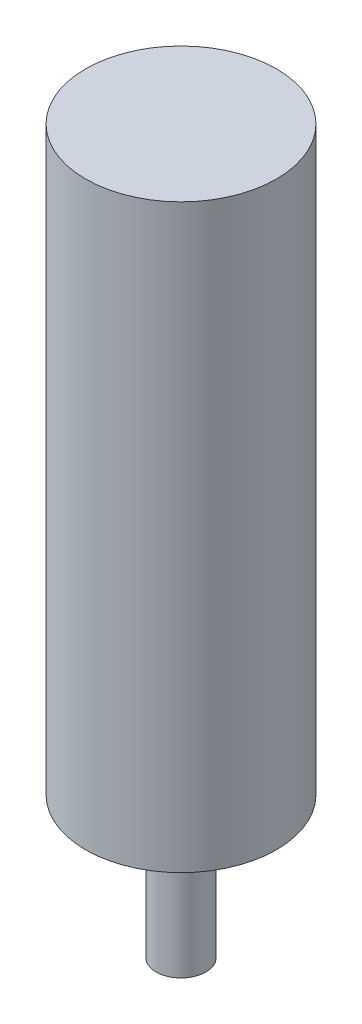
ISO-10303-21;
HEADER;
FILE_DESCRIPTION(('STEP AP214'),'2;1');
FILE_NAME('part.step','',(''),(''),'','','');
FILE_SCHEMA(('AUTOMOTIVE_DESIGN { 1 0 10303 214 1 1 1 1 }'));
ENDSEC;
DATA;
#1=APPLICATION_CONTEXT('core data for automotive mechanical design processes');
#2=APPLICATION_PROTOCOL_DEFINITION('international standard','automotive_design',2000,#1);
#3=PRODUCT_CONTEXT('',#1,'mechanical');
#4=PRODUCT('Part','Part','',(#3));
#5=PRODUCT_RELATED_PRODUCT_CATEGORY('part','',(#4));
#6=PRODUCT_DEFINITION_FORMATION('','',#4);
#7=PRODUCT_DEFINITION_CONTEXT('part definition',#1,'design');
#8=PRODUCT_DEFINITION('design','',#6,#7);
#9=PRODUCT_DEFINITION_SHAPE('','',#8);
#10=(LENGTH_UNIT() NAMED_UNIT(*) SI_UNIT(.MILLI.,.METRE.));
#11=(NAMED_UNIT(*) PLANE_ANGLE_UNIT() SI_UNIT($,.RADIAN.));
#12=(NAMED_UNIT(*) SI_UNIT($,.STERADIAN.) SOLID_ANGLE_UNIT());
#13=UNCERTAINTY_MEASURE_WITH_UNIT(LENGTH_MEASURE(1.E-05),#10,'distance_accuracy_value','');
#14=(GEOMETRIC_REPRESENTATION_CONTEXT(3) GLOBAL_UNCERTAINTY_ASSIGNED_CONTEXT((#13)) GLOBAL_UNIT_ASSIGNED_CONTEXT((#10,
#11,#12)) REPRESENTATION_CONTEXT('',''));
#15=CARTESIAN_POINT('',(0.,0.,0.));
#16=DIRECTION('',(0.,0.,1.));
#17=DIRECTION('',(1.,0.,0.));
#18=AXIS2_PLACEMENT_3D('',#15,#16,#17);
#19=CARTESIAN_POINT('',(0.,-1.,0.));
#20=DIRECTION('',(0.,-1.,0.));
#21=DIRECTION('',(0.,0.,-1.));
#22=AXIS2_PLACEMENT_3D('',#19,#20,#21);
#23=PLANE('',#22);
#24=CARTESIAN_POINT('',(0.,-1.,0.));
#25=DIRECTION('',(0.,-1.,0.));
#26=DIRECTION('',(0.,0.,-1.));
#27=AXIS2_PLACEMENT_3D('',#24,#25,#26);
#28=CIRCLE('',#27,7.5);
#29=CARTESIAN_POINT('',(0.,-1.,-7.5));
#30=VERTEX_POINT('',#29);
#31=EDGE_CURVE('E45',#30,#30,#28,.T.);
#32=ORIENTED_EDGE('',*,*,#31,.T.);
#33=EDGE_LOOP('',(#32));
#34=FACE_BOUND('',#33,.T.);
#35=CARTESIAN_POINT('',(0.,-1.,0.));
#36=DIRECTION('',(0.,-1.,0.));
#37=DIRECTION('',(0.,0.,-1.));
#38=AXIS2_PLACEMENT_3D('',#35,#36,#37);
#39=CIRCLE('',#38,3.);
#40=CARTESIAN_POINT('',(0.,-1.,-3.));
#41=VERTEX_POINT('',#40);
#42=EDGE_CURVE('E50',#41,#41,#39,.T.);
#43=ORIENTED_EDGE('',*,*,#42,.F.);
#44=EDGE_LOOP('',(#43));
#45=FACE_BOUND('',#44,.T.);
#46=ADVANCED_FACE('F29',(#34,#45),#23,.T.);
#47=CARTESIAN_POINT('',(0.,0.,0.));
#48=DIRECTION('',(0.,1.,0.));
#49=DIRECTION('',(0.,0.,1.));
#50=AXIS2_PLACEMENT_3D('',#47,#48,#49);
#51=PLANE('',#50);
#52=CARTESIAN_POINT('',(0.,0.,0.));
#53=DIRECTION('',(0.,1.,0.));
#54=DIRECTION('',(0.,0.,1.));
#55=AXIS2_PLACEMENT_3D('',#52,#53,#54);
#56=CIRCLE('',#55,11.5);
#57=CARTESIAN_POINT('',(0.,0.,11.5));
#58=VERTEX_POINT('',#57);
#59=EDGE_CURVE('E40',#58,#58,#56,.T.);
#60=ORIENTED_EDGE('',*,*,#59,.F.);
#61=EDGE_LOOP('',(#60));
#62=FACE_BOUND('',#61,.T.);
#63=CARTESIAN_POINT('',(0.,0.,0.));
#64=DIRECTION('',(0.,1.,0.));
#65=DIRECTION('',(0.,0.,1.));
#66=AXIS2_PLACEMENT_3D('',#63,#64,#65);
#67=CIRCLE('',#66,7.5);
#68=CARTESIAN_POINT('',(0.,0.,7.5));
#69=VERTEX_POINT('',#68);
#70=EDGE_CURVE('E10',#69,#69,#67,.F.);
#71=ORIENTED_EDGE('',*,*,#70,.F.);
#72=EDGE_LOOP('',(#71));
#73=FACE_BOUND('',#72,.T.);
#74=ADVANCED_FACE('F66',(#62,#73),#51,.F.);
#75=CARTESIAN_POINT('',(0.,70.,0.));
#76=DIRECTION('',(0.,-1.,0.));
#77=DIRECTION('',(0.,0.,-1.));
#78=AXIS2_PLACEMENT_3D('',#75,#76,#77);
#79=CYLINDRICAL_SURFACE('',#78,11.5);
#80=CARTESIAN_POINT('',(0.,70.,0.));
#81=DIRECTION('',(0.,1.,0.));
#82=DIRECTION('',(0.,0.,1.));
#83=AXIS2_PLACEMENT_3D('',#80,#81,#82);
#84=CIRCLE('',#83,11.5);
#85=CARTESIAN_POINT('',(0.,70.,11.5));
#86=VERTEX_POINT('',#85);
#87=EDGE_CURVE('E36',#86,#86,#84,.T.);
#88=ORIENTED_EDGE('',*,*,#87,.F.);
#89=EDGE_LOOP('',(#88));
#90=FACE_BOUND('',#89,.T.);
#91=ORIENTED_EDGE('',*,*,#59,.T.);
#92=EDGE_LOOP('',(#91));
#93=FACE_BOUND('',#92,.T.);
#94=ADVANCED_FACE('F31',(#90,#93),#79,.T.);
#95=CARTESIAN_POINT('',(0.,70.,0.));
#96=DIRECTION('',(0.,1.,0.));
#97=DIRECTION('',(0.,0.,1.));
#98=AXIS2_PLACEMENT_3D('',#95,#96,#97);
#99=PLANE('',#98);
#100=ORIENTED_EDGE('',*,*,#87,.T.);
#101=EDGE_LOOP('',(#100));
#102=FACE_BOUND('',#101,.T.);
#103=ADVANCED_FACE('F77',(#102),#99,.T.);
#104=CARTESIAN_POINT('',(0.,-1.,0.));
#105=DIRECTION('',(0.,1.,0.));
#106=DIRECTION('',(0.,0.,1.));
#107=AXIS2_PLACEMENT_3D('',#104,#105,#106);
#108=CYLINDRICAL_SURFACE('',#107,7.5);
#109=ORIENTED_EDGE('',*,*,#31,.F.);
#110=EDGE_LOOP('',(#109));
#111=FACE_BOUND('',#110,.T.);
#112=ORIENTED_EDGE('',*,*,#70,.T.);
#113=EDGE_LOOP('',(#112));
#114=FACE_BOUND('',#113,.T.);
#115=ADVANCED_FACE('F61',(#111,#114),#108,.T.);
#116=CARTESIAN_POINT('',(0.,-17.,0.));
#117=DIRECTION('',(0.,1.,0.));
#118=DIRECTION('',(0.,0.,1.));
#119=AXIS2_PLACEMENT_3D('',#116,#117,#118);
#120=CYLINDRICAL_SURFACE('',#119,3.);
#121=CARTESIAN_POINT('',(0.,-17.,0.));
#122=DIRECTION('',(0.,-1.,0.));
#123=DIRECTION('',(0.,0.,-1.));
#124=AXIS2_PLACEMENT_3D('',#121,#122,#123);
#125=CIRCLE('',#124,3.);
#126=CARTESIAN_POINT('',(0.,-17.,-3.));
#127=VERTEX_POINT('',#126);
#128=EDGE_CURVE('E49',#127,#127,#125,.T.);
#129=ORIENTED_EDGE('',*,*,#128,.F.);
#130=EDGE_LOOP('',(#129));
#131=FACE_BOUND('',#130,.T.);
#132=ORIENTED_EDGE('',*,*,#42,.T.);
#133=EDGE_LOOP('',(#132));
#134=FACE_BOUND('',#133,.T.);
#135=ADVANCED_FACE('F58',(#131,#134),#120,.T.);
#136=CARTESIAN_POINT('',(0.,-17.,0.));
#137=DIRECTION('',(0.,-1.,0.));
#138=DIRECTION('',(0.,0.,-1.));
#139=AXIS2_PLACEMENT_3D('',#136,#137,#138);
#140=PLANE('',#139);
#141=ORIENTED_EDGE('',*,*,#128,.T.);
#142=EDGE_LOOP('',(#141));
#143=FACE_BOUND('',#142,.T.);
#144=ADVANCED_FACE('F56',(#143),#140,.T.);
#145=CLOSED_SHELL('',(#46,#74,#94,#103,#115,#135,#144));
#146=MANIFOLD_SOLID_BREP('B2',#145);
#147=ADVANCED_BREP_SHAPE_REPRESENTATION('',(#18,#146),#14);
#148=SHAPE_DEFINITION_REPRESENTATION(#9,#147);
ENDSEC;
END-ISO-10303-21;
